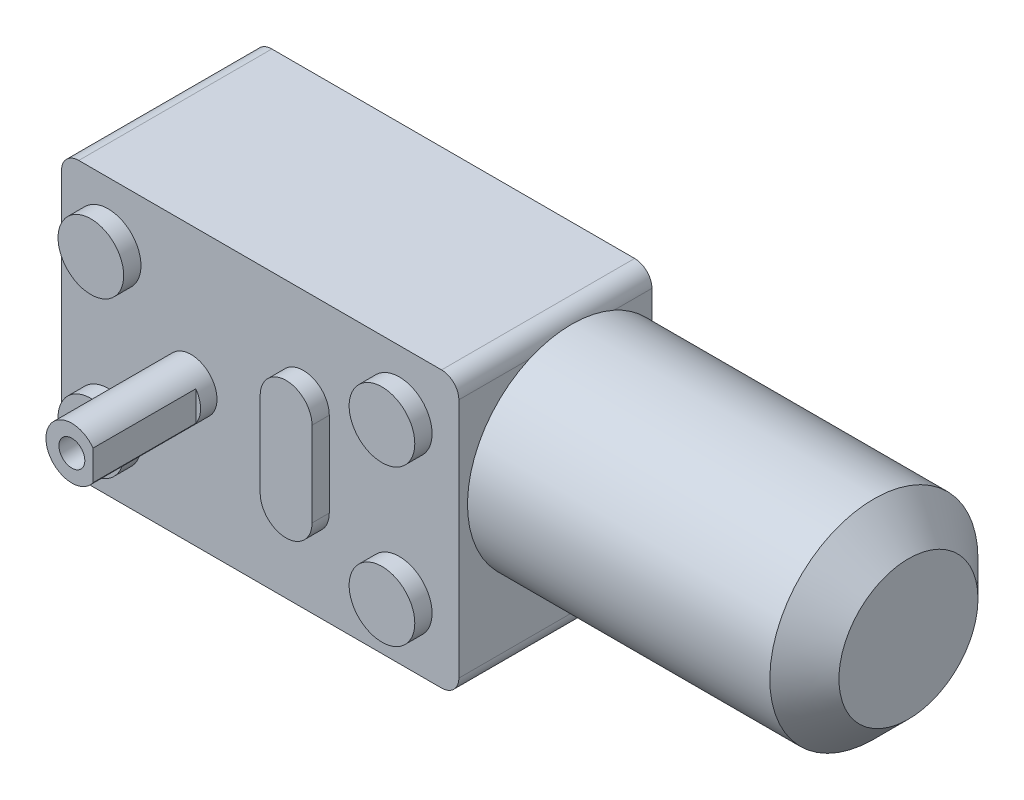
ISO-10303-21;
HEADER;
FILE_DESCRIPTION(('STEP AP214'),'2;1');
FILE_NAME('part.step','',(''),(''),'','','');
FILE_SCHEMA(('AUTOMOTIVE_DESIGN { 1 0 10303 214 1 1 1 1 }'));
ENDSEC;
DATA;
#1=APPLICATION_CONTEXT('core data for automotive mechanical design processes');
#2=APPLICATION_PROTOCOL_DEFINITION('international standard','automotive_design',2000,#1);
#3=PRODUCT_CONTEXT('',#1,'mechanical');
#4=PRODUCT('Part','Part','',(#3));
#5=PRODUCT_RELATED_PRODUCT_CATEGORY('part','',(#4));
#6=PRODUCT_DEFINITION_FORMATION('','',#4);
#7=PRODUCT_DEFINITION_CONTEXT('part definition',#1,'design');
#8=PRODUCT_DEFINITION('design','',#6,#7);
#9=PRODUCT_DEFINITION_SHAPE('','',#8);
#10=(LENGTH_UNIT() NAMED_UNIT(*) SI_UNIT(.MILLI.,.METRE.));
#11=(NAMED_UNIT(*) PLANE_ANGLE_UNIT() SI_UNIT($,.RADIAN.));
#12=(NAMED_UNIT(*) SI_UNIT($,.STERADIAN.) SOLID_ANGLE_UNIT());
#13=UNCERTAINTY_MEASURE_WITH_UNIT(LENGTH_MEASURE(1.E-05),#10,'distance_accuracy_value','');
#14=(GEOMETRIC_REPRESENTATION_CONTEXT(3) GLOBAL_UNCERTAINTY_ASSIGNED_CONTEXT((#13)) GLOBAL_UNIT_ASSIGNED_CONTEXT((#10,
#11,#12)) REPRESENTATION_CONTEXT('',''));
#15=CARTESIAN_POINT('',(0.,0.,0.));
#16=DIRECTION('',(0.,0.,1.));
#17=DIRECTION('',(1.,0.,0.));
#18=AXIS2_PLACEMENT_3D('',#15,#16,#17);
#19=CARTESIAN_POINT('',(31.,0.,-22.35));
#20=DIRECTION('',(1.,0.,0.));
#21=DIRECTION('',(0.,0.,-1.));
#22=AXIS2_PLACEMENT_3D('',#19,#20,#21);
#23=PLANE('',#22);
#24=DIRECTION('',(0.,1.,0.));
#25=VECTOR('',#24,1.);
#26=CARTESIAN_POINT('',(31.,0.,-22.35));
#27=LINE('',#26,#25);
#28=CARTESIAN_POINT('',(31.,-13.95,-22.35));
#29=VERTEX_POINT('',#28);
#30=CARTESIAN_POINT('',(31.,-4.71240823762345,-22.35));
#31=VERTEX_POINT('',#30);
#32=EDGE_CURVE('E151',#29,#31,#27,.T.);
#33=ORIENTED_EDGE('',*,*,#32,.T.);
#34=CARTESIAN_POINT('',(31.,2.95000000000001,-13.05));
#35=DIRECTION('',(1.,0.,0.));
#36=DIRECTION('',(0.,0.,-1.));
#37=AXIS2_PLACEMENT_3D('',#34,#35,#36);
#38=CIRCLE('',#37,12.05);
#39=CARTESIAN_POINT('',(31.,13.95,-8.13039635742878));
#40=VERTEX_POINT('',#39);
#41=EDGE_CURVE('E75',#40,#31,#38,.T.);
#42=ORIENTED_EDGE('',*,*,#41,.F.);
#43=DIRECTION('',(0.,0.,1.));
#44=VECTOR('',#43,1.);
#45=CARTESIAN_POINT('',(31.,13.95,-22.35));
#46=LINE('',#45,#44);
#47=CARTESIAN_POINT('',(31.,13.95,0.));
#48=VERTEX_POINT('',#47);
#49=EDGE_CURVE('E242',#40,#48,#46,.T.);
#50=ORIENTED_EDGE('',*,*,#49,.T.);
#51=DIRECTION('',(0.,1.,0.));
#52=VECTOR('',#51,1.);
#53=CARTESIAN_POINT('',(31.,0.,0.));
#54=LINE('',#53,#52);
#55=CARTESIAN_POINT('',(31.,-13.95,0.));
#56=VERTEX_POINT('',#55);
#57=EDGE_CURVE('E215',#56,#48,#54,.T.);
#58=ORIENTED_EDGE('',*,*,#57,.F.);
#59=DIRECTION('',(0.,0.,1.));
#60=VECTOR('',#59,1.);
#61=CARTESIAN_POINT('',(31.,-13.95,-22.35));
#62=LINE('',#61,#60);
#63=EDGE_CURVE('E243',#29,#56,#62,.T.);
#64=ORIENTED_EDGE('',*,*,#63,.F.);
#65=EDGE_LOOP('',(#33,#42,#50,#58,#64));
#66=FACE_BOUND('',#65,.T.);
#67=ADVANCED_FACE('F58',(#66),#23,.T.);
#68=CARTESIAN_POINT('',(-15.,0.,-22.35));
#69=DIRECTION('',(1.,0.,0.));
#70=DIRECTION('',(0.,1.,0.));
#71=AXIS2_PLACEMENT_3D('',#68,#69,#70);
#72=PLANE('',#71);
#73=DIRECTION('',(0.,1.,0.));
#74=VECTOR('',#73,1.);
#75=CARTESIAN_POINT('',(-15.,0.,0.));
#76=LINE('',#75,#74);
#77=CARTESIAN_POINT('',(-15.,-13.95,0.));
#78=VERTEX_POINT('',#77);
#79=CARTESIAN_POINT('',(-15.,13.95,0.));
#80=VERTEX_POINT('',#79);
#81=EDGE_CURVE('E174',#78,#80,#76,.T.);
#82=ORIENTED_EDGE('',*,*,#81,.T.);
#83=DIRECTION('',(0.,0.,1.));
#84=VECTOR('',#83,1.);
#85=CARTESIAN_POINT('',(-15.,13.95,-22.35));
#86=LINE('',#85,#84);
#87=CARTESIAN_POINT('',(-15.,13.95,-22.35));
#88=VERTEX_POINT('',#87);
#89=EDGE_CURVE('E229',#88,#80,#86,.T.);
#90=ORIENTED_EDGE('',*,*,#89,.F.);
#91=DIRECTION('',(0.,1.,0.));
#92=VECTOR('',#91,1.);
#93=CARTESIAN_POINT('',(-15.,0.,-22.35));
#94=LINE('',#93,#92);
#95=CARTESIAN_POINT('',(-15.,-13.95,-22.35));
#96=VERTEX_POINT('',#95);
#97=EDGE_CURVE('E175',#96,#88,#94,.T.);
#98=ORIENTED_EDGE('',*,*,#97,.F.);
#99=DIRECTION('',(0.,0.,1.));
#100=VECTOR('',#99,1.);
#101=CARTESIAN_POINT('',(-15.,-13.95,-22.35));
#102=LINE('',#101,#100);
#103=EDGE_CURVE('E199',#96,#78,#102,.T.);
#104=ORIENTED_EDGE('',*,*,#103,.T.);
#105=EDGE_LOOP('',(#82,#90,#98,#104));
#106=FACE_BOUND('',#105,.T.);
#107=ADVANCED_FACE('F270',(#106),#72,.F.);
#108=CARTESIAN_POINT('',(-13.,13.95,-22.35));
#109=DIRECTION('',(0.,0.,1.));
#110=DIRECTION('',(1.,0.,0.));
#111=AXIS2_PLACEMENT_3D('',#108,#109,#110);
#112=CYLINDRICAL_SURFACE('',#111,2.);
#113=CARTESIAN_POINT('',(-13.,13.95,0.));
#114=DIRECTION('',(0.,0.,1.));
#115=DIRECTION('',(1.,0.,0.));
#116=AXIS2_PLACEMENT_3D('',#113,#114,#115);
#117=CIRCLE('',#116,2.);
#118=CARTESIAN_POINT('',(-13.,15.95,0.));
#119=VERTEX_POINT('',#118);
#120=EDGE_CURVE('E179',#80,#119,#117,.F.);
#121=ORIENTED_EDGE('',*,*,#120,.T.);
#122=DIRECTION('',(0.,0.,1.));
#123=VECTOR('',#122,1.);
#124=CARTESIAN_POINT('',(-13.,15.95,-22.35));
#125=LINE('',#124,#123);
#126=CARTESIAN_POINT('',(-13.,15.95,-22.35));
#127=VERTEX_POINT('',#126);
#128=EDGE_CURVE('E233',#127,#119,#125,.T.);
#129=ORIENTED_EDGE('',*,*,#128,.F.);
#130=CARTESIAN_POINT('',(-13.,13.95,-22.35));
#131=DIRECTION('',(0.,0.,1.));
#132=DIRECTION('',(1.,0.,0.));
#133=AXIS2_PLACEMENT_3D('',#130,#131,#132);
#134=CIRCLE('',#133,2.);
#135=EDGE_CURVE('E196',#88,#127,#134,.F.);
#136=ORIENTED_EDGE('',*,*,#135,.F.);
#137=ORIENTED_EDGE('',*,*,#89,.T.);
#138=EDGE_LOOP('',(#121,#129,#136,#137));
#139=FACE_BOUND('',#138,.T.);
#140=ADVANCED_FACE('F277',(#139),#112,.T.);
#141=CARTESIAN_POINT('',(0.,15.95,-22.35));
#142=DIRECTION('',(0.,-1.,0.));
#143=DIRECTION('',(1.,0.,0.));
#144=AXIS2_PLACEMENT_3D('',#141,#142,#143);
#145=PLANE('',#144);
#146=DIRECTION('',(1.,0.,0.));
#147=VECTOR('',#146,1.);
#148=CARTESIAN_POINT('',(0.,15.95,0.));
#149=LINE('',#148,#147);
#150=CARTESIAN_POINT('',(29.,15.95,0.));
#151=VERTEX_POINT('',#150);
#152=EDGE_CURVE('E223',#119,#151,#149,.T.);
#153=ORIENTED_EDGE('',*,*,#152,.T.);
#154=DIRECTION('',(0.,0.,1.));
#155=VECTOR('',#154,1.);
#156=CARTESIAN_POINT('',(29.,15.95,-22.35));
#157=LINE('',#156,#155);
#158=CARTESIAN_POINT('',(29.,15.95,-22.35));
#159=VERTEX_POINT('',#158);
#160=EDGE_CURVE('E237',#159,#151,#157,.T.);
#161=ORIENTED_EDGE('',*,*,#160,.F.);
#162=DIRECTION('',(1.,0.,0.));
#163=VECTOR('',#162,1.);
#164=CARTESIAN_POINT('',(0.,15.95,-22.35));
#165=LINE('',#164,#163);
#166=EDGE_CURVE('E193',#127,#159,#165,.T.);
#167=ORIENTED_EDGE('',*,*,#166,.F.);
#168=ORIENTED_EDGE('',*,*,#128,.T.);
#169=EDGE_LOOP('',(#153,#161,#167,#168));
#170=FACE_BOUND('',#169,.T.);
#171=ADVANCED_FACE('F290',(#170),#145,.F.);
#172=CARTESIAN_POINT('',(29.,13.95,-22.35));
#173=DIRECTION('',(0.,0.,1.));
#174=DIRECTION('',(1.,0.,0.));
#175=AXIS2_PLACEMENT_3D('',#172,#173,#174);
#176=CYLINDRICAL_SURFACE('',#175,2.);
#177=CARTESIAN_POINT('',(29.,13.95,0.));
#178=DIRECTION('',(0.,0.,1.));
#179=DIRECTION('',(1.,0.,0.));
#180=AXIS2_PLACEMENT_3D('',#177,#178,#179);
#181=CIRCLE('',#180,2.);
#182=EDGE_CURVE('E219',#48,#151,#181,.T.);
#183=ORIENTED_EDGE('',*,*,#182,.F.);
#184=ORIENTED_EDGE('',*,*,#49,.F.);
#185=DIRECTION('',(0.,0.,1.));
#186=VECTOR('',#185,1.);
#187=CARTESIAN_POINT('',(31.,13.95,-22.35));
#188=LINE('',#187,#186);
#189=CARTESIAN_POINT('',(31.,13.95,-17.9696036425712));
#190=VERTEX_POINT('',#189);
#191=EDGE_CURVE('E82',#40,#190,#188,.F.);
#192=ORIENTED_EDGE('',*,*,#191,.T.);
#193=CARTESIAN_POINT('',(31.,13.95,-22.35));
#194=VERTEX_POINT('',#193);
#195=EDGE_CURVE('E155',#194,#190,#46,.T.);
#196=ORIENTED_EDGE('',*,*,#195,.F.);
#197=CARTESIAN_POINT('',(29.,13.95,-22.35));
#198=DIRECTION('',(0.,0.,1.));
#199=DIRECTION('',(1.,0.,0.));
#200=AXIS2_PLACEMENT_3D('',#197,#198,#199);
#201=CIRCLE('',#200,2.);
#202=EDGE_CURVE('E146',#194,#159,#201,.T.);
#203=ORIENTED_EDGE('',*,*,#202,.T.);
#204=ORIENTED_EDGE('',*,*,#160,.T.);
#205=EDGE_LOOP('',(#183,#184,#192,#196,#203,#204));
#206=FACE_BOUND('',#205,.T.);
#207=ADVANCED_FACE('F283',(#206),#176,.T.);
#208=ORIENTED_EDGE('',*,*,#195,.T.);
#209=CARTESIAN_POINT('',(31.,10.6124082376235,-22.35));
#210=VERTEX_POINT('',#209);
#211=EDGE_CURVE('E153',#210,#190,#38,.T.);
#212=ORIENTED_EDGE('',*,*,#211,.F.);
#213=EDGE_CURVE('E138',#210,#194,#27,.T.);
#214=ORIENTED_EDGE('',*,*,#213,.T.);
#215=EDGE_LOOP('',(#208,#212,#214));
#216=FACE_BOUND('',#215,.T.);
#217=ADVANCED_FACE('F154',(#216),#23,.T.);
#218=CARTESIAN_POINT('',(29.,-13.95,-22.35));
#219=DIRECTION('',(0.,0.,1.));
#220=DIRECTION('',(1.,0.,0.));
#221=AXIS2_PLACEMENT_3D('',#218,#219,#220);
#222=CYLINDRICAL_SURFACE('',#221,2.);
#223=CARTESIAN_POINT('',(29.,-13.95,0.));
#224=DIRECTION('',(0.,0.,1.));
#225=DIRECTION('',(1.,0.,0.));
#226=AXIS2_PLACEMENT_3D('',#223,#224,#225);
#227=CIRCLE('',#226,2.);
#228=CARTESIAN_POINT('',(29.,-15.95,0.));
#229=VERTEX_POINT('',#228);
#230=EDGE_CURVE('E211',#229,#56,#227,.T.);
#231=ORIENTED_EDGE('',*,*,#230,.F.);
#232=DIRECTION('',(0.,0.,1.));
#233=VECTOR('',#232,1.);
#234=CARTESIAN_POINT('',(29.,-15.95,-22.35));
#235=LINE('',#234,#233);
#236=CARTESIAN_POINT('',(29.,-15.95,-22.35));
#237=VERTEX_POINT('',#236);
#238=EDGE_CURVE('E246',#237,#229,#235,.T.);
#239=ORIENTED_EDGE('',*,*,#238,.F.);
#240=CARTESIAN_POINT('',(29.,-13.95,-22.35));
#241=DIRECTION('',(0.,0.,1.));
#242=DIRECTION('',(1.,0.,0.));
#243=AXIS2_PLACEMENT_3D('',#240,#241,#242);
#244=CIRCLE('',#243,2.);
#245=EDGE_CURVE('E149',#237,#29,#244,.T.);
#246=ORIENTED_EDGE('',*,*,#245,.T.);
#247=ORIENTED_EDGE('',*,*,#63,.T.);
#248=EDGE_LOOP('',(#231,#239,#246,#247));
#249=FACE_BOUND('',#248,.T.);
#250=ADVANCED_FACE('F282',(#249),#222,.T.);
#251=CARTESIAN_POINT('',(0.,-15.95,-22.35));
#252=DIRECTION('',(0.,-1.,0.));
#253=DIRECTION('',(1.,0.,0.));
#254=AXIS2_PLACEMENT_3D('',#251,#252,#253);
#255=PLANE('',#254);
#256=DIRECTION('',(1.,0.,0.));
#257=VECTOR('',#256,1.);
#258=CARTESIAN_POINT('',(0.,-15.95,0.));
#259=LINE('',#258,#257);
#260=CARTESIAN_POINT('',(-13.,-15.95,0.));
#261=VERTEX_POINT('',#260);
#262=EDGE_CURVE('E207',#261,#229,#259,.T.);
#263=ORIENTED_EDGE('',*,*,#262,.F.);
#264=DIRECTION('',(0.,0.,1.));
#265=VECTOR('',#264,1.);
#266=CARTESIAN_POINT('',(-13.,-15.95,-22.35));
#267=LINE('',#266,#265);
#268=CARTESIAN_POINT('',(-13.,-15.95,-22.35));
#269=VERTEX_POINT('',#268);
#270=EDGE_CURVE('E249',#269,#261,#267,.T.);
#271=ORIENTED_EDGE('',*,*,#270,.F.);
#272=DIRECTION('',(1.,0.,0.));
#273=VECTOR('',#272,1.);
#274=CARTESIAN_POINT('',(0.,-15.95,-22.35));
#275=LINE('',#274,#273);
#276=EDGE_CURVE('E183',#269,#237,#275,.T.);
#277=ORIENTED_EDGE('',*,*,#276,.T.);
#278=ORIENTED_EDGE('',*,*,#238,.T.);
#279=EDGE_LOOP('',(#263,#271,#277,#278));
#280=FACE_BOUND('',#279,.T.);
#281=ADVANCED_FACE('F288',(#280),#255,.T.);
#282=CARTESIAN_POINT('',(-13.,-13.95,-22.35));
#283=DIRECTION('',(0.,0.,1.));
#284=DIRECTION('',(1.,0.,0.));
#285=AXIS2_PLACEMENT_3D('',#282,#283,#284);
#286=CYLINDRICAL_SURFACE('',#285,2.);
#287=CARTESIAN_POINT('',(-13.,-13.95,0.));
#288=DIRECTION('',(0.,0.,1.));
#289=DIRECTION('',(1.,0.,0.));
#290=AXIS2_PLACEMENT_3D('',#287,#288,#289);
#291=CIRCLE('',#290,2.);
#292=EDGE_CURVE('E203',#78,#261,#291,.T.);
#293=ORIENTED_EDGE('',*,*,#292,.F.);
#294=ORIENTED_EDGE('',*,*,#103,.F.);
#295=CARTESIAN_POINT('',(-13.,-13.95,-22.35));
#296=DIRECTION('',(0.,0.,1.));
#297=DIRECTION('',(1.,0.,0.));
#298=AXIS2_PLACEMENT_3D('',#295,#296,#297);
#299=CIRCLE('',#298,2.);
#300=EDGE_CURVE('E178',#96,#269,#299,.T.);
#301=ORIENTED_EDGE('',*,*,#300,.T.);
#302=ORIENTED_EDGE('',*,*,#270,.T.);
#303=EDGE_LOOP('',(#293,#294,#301,#302));
#304=FACE_BOUND('',#303,.T.);
#305=ADVANCED_FACE('F305',(#304),#286,.T.);
#306=CARTESIAN_POINT('',(0.,0.,-22.35));
#307=DIRECTION('',(0.,0.,1.));
#308=DIRECTION('',(1.,0.,0.));
#309=AXIS2_PLACEMENT_3D('',#306,#307,#308);
#310=PLANE('',#309);
#311=ORIENTED_EDGE('',*,*,#97,.T.);
#312=ORIENTED_EDGE('',*,*,#135,.T.);
#313=ORIENTED_EDGE('',*,*,#166,.T.);
#314=ORIENTED_EDGE('',*,*,#202,.F.);
#315=ORIENTED_EDGE('',*,*,#213,.F.);
#316=EDGE_CURVE('E144',#31,#210,#27,.T.);
#317=ORIENTED_EDGE('',*,*,#316,.F.);
#318=ORIENTED_EDGE('',*,*,#32,.F.);
#319=ORIENTED_EDGE('',*,*,#245,.F.);
#320=ORIENTED_EDGE('',*,*,#276,.F.);
#321=ORIENTED_EDGE('',*,*,#300,.F.);
#322=EDGE_LOOP('',(#311,#312,#313,#314,#315,#317,#318,#319,#320,#321));
#323=FACE_BOUND('',#322,.T.);
#324=ADVANCED_FACE('F141',(#323),#310,.F.);
#325=CARTESIAN_POINT('',(0.,0.,0.));
#326=DIRECTION('',(0.,0.,1.));
#327=DIRECTION('',(1.,0.,0.));
#328=AXIS2_PLACEMENT_3D('',#325,#326,#327);
#329=PLANE('',#328);
#330=ORIENTED_EDGE('',*,*,#81,.F.);
#331=ORIENTED_EDGE('',*,*,#292,.T.);
#332=ORIENTED_EDGE('',*,*,#262,.T.);
#333=ORIENTED_EDGE('',*,*,#230,.T.);
#334=ORIENTED_EDGE('',*,*,#57,.T.);
#335=ORIENTED_EDGE('',*,*,#182,.T.);
#336=ORIENTED_EDGE('',*,*,#152,.F.);
#337=ORIENTED_EDGE('',*,*,#120,.F.);
#338=EDGE_LOOP('',(#330,#331,#332,#333,#334,#335,#336,#337));
#339=FACE_BOUND('',#338,.T.);
#340=ADVANCED_FACE('F301',(#339),#329,.T.);
#341=CARTESIAN_POINT('',(31.,2.95000000000001,-13.05));
#342=DIRECTION('',(1.,0.,0.));
#343=DIRECTION('',(0.,0.,-1.));
#344=AXIS2_PLACEMENT_3D('',#341,#342,#343);
#345=PLANE('',#344);
#346=EDGE_CURVE('E163',#31,#210,#38,.T.);
#347=ORIENTED_EDGE('',*,*,#346,.F.);
#348=ORIENTED_EDGE('',*,*,#316,.T.);
#349=EDGE_LOOP('',(#347,#348));
#350=FACE_BOUND('',#349,.T.);
#351=ADVANCED_FACE('F166',(#350),#345,.F.);
#352=CARTESIAN_POINT('',(70.,2.95000000000001,-13.05));
#353=DIRECTION('',(-1.,0.,0.));
#354=DIRECTION('',(0.,0.,1.));
#355=AXIS2_PLACEMENT_3D('',#352,#353,#354);
#356=CYLINDRICAL_SURFACE('',#355,12.05);
#357=CARTESIAN_POINT('',(66.,2.95000000000001,-13.05));
#358=DIRECTION('',(1.,0.,0.));
#359=DIRECTION('',(0.,0.,-1.));
#360=AXIS2_PLACEMENT_3D('',#357,#358,#359);
#361=CIRCLE('',#360,12.05);
#362=CARTESIAN_POINT('',(66.,2.95000000000001,-25.1));
#363=VERTEX_POINT('',#362);
#364=EDGE_CURVE('E12',#363,#363,#361,.F.);
#365=ORIENTED_EDGE('',*,*,#364,.T.);
#366=EDGE_LOOP('',(#365));
#367=FACE_BOUND('',#366,.T.);
#368=ORIENTED_EDGE('',*,*,#211,.T.);
#369=EDGE_CURVE('E161',#190,#40,#38,.T.);
#370=ORIENTED_EDGE('',*,*,#369,.T.);
#371=ORIENTED_EDGE('',*,*,#41,.T.);
#372=ORIENTED_EDGE('',*,*,#346,.T.);
#373=EDGE_LOOP('',(#368,#370,#371,#372));
#374=FACE_BOUND('',#373,.T.);
#375=ADVANCED_FACE('F168',(#367,#374),#356,.T.);
#376=CARTESIAN_POINT('',(70.,2.95000000000001,-13.05));
#377=DIRECTION('',(1.,0.,0.));
#378=DIRECTION('',(0.,0.,-1.));
#379=AXIS2_PLACEMENT_3D('',#376,#377,#378);
#380=PLANE('',#379);
#381=CARTESIAN_POINT('',(70.,2.95000000000001,-13.05));
#382=DIRECTION('',(1.,0.,0.));
#383=DIRECTION('',(0.,0.,-1.));
#384=AXIS2_PLACEMENT_3D('',#381,#382,#383);
#385=CIRCLE('',#384,8.05);
#386=CARTESIAN_POINT('',(70.,2.95000000000001,-21.1));
#387=VERTEX_POINT('',#386);
#388=EDGE_CURVE('E68',#387,#387,#385,.T.);
#389=ORIENTED_EDGE('',*,*,#388,.T.);
#390=EDGE_LOOP('',(#389));
#391=FACE_BOUND('',#390,.T.);
#392=ADVANCED_FACE('F257',(#391),#380,.T.);
#393=ORIENTED_EDGE('',*,*,#191,.F.);
#394=ORIENTED_EDGE('',*,*,#369,.F.);
#395=EDGE_LOOP('',(#393,#394));
#396=FACE_BOUND('',#395,.T.);
#397=ADVANCED_FACE('F260',(#396),#345,.F.);
#398=CARTESIAN_POINT('',(70.,2.95000000000001,-13.05));
#399=DIRECTION('',(-1.,0.,0.));
#400=DIRECTION('',(0.,0.,1.));
#401=AXIS2_PLACEMENT_3D('',#398,#399,#400);
#402=CONICAL_SURFACE('',#401,8.05,0.785398163397447);
#403=ORIENTED_EDGE('',*,*,#364,.F.);
#404=EDGE_LOOP('',(#403));
#405=FACE_BOUND('',#404,.T.);
#406=ORIENTED_EDGE('',*,*,#388,.F.);
#407=EDGE_LOOP('',(#406));
#408=FACE_BOUND('',#407,.T.);
#409=ADVANCED_FACE('F61',(#405,#408),#402,.T.);
#410=CLOSED_SHELL('',(#67,#107,#140,#171,#207,#217,#250,#281,#305,#324,#340,#351,#375,#392,#397,#409));
#411=MANIFOLD_SOLID_BREP('B2',#410);
#412=CARTESIAN_POINT('',(-9.6,-9.,2.));
#413=DIRECTION('',(0.,0.,-1.));
#414=DIRECTION('',(-1.,0.,0.));
#415=AXIS2_PLACEMENT_3D('',#412,#413,#414);
#416=CYLINDRICAL_SURFACE('',#415,3.8);
#417=CARTESIAN_POINT('',(-9.6,-9.,2.));
#418=DIRECTION('',(0.,0.,1.));
#419=DIRECTION('',(1.,0.,0.));
#420=AXIS2_PLACEMENT_3D('',#417,#418,#419);
#421=CIRCLE('',#420,3.8);
#422=CARTESIAN_POINT('',(-5.8,-9.,2.));
#423=VERTEX_POINT('',#422);
#424=EDGE_CURVE('E57',#423,#423,#421,.T.);
#425=ORIENTED_EDGE('',*,*,#424,.F.);
#426=EDGE_LOOP('',(#425));
#427=FACE_BOUND('',#426,.T.);
#428=CARTESIAN_POINT('',(-9.6,-9.,0.));
#429=DIRECTION('',(0.,0.,1.));
#430=DIRECTION('',(1.,0.,0.));
#431=AXIS2_PLACEMENT_3D('',#428,#429,#430);
#432=CIRCLE('',#431,3.8);
#433=CARTESIAN_POINT('',(-5.8,-9.,0.));
#434=VERTEX_POINT('',#433);
#435=EDGE_CURVE('E436',#434,#434,#432,.T.);
#436=ORIENTED_EDGE('',*,*,#435,.T.);
#437=EDGE_LOOP('',(#436));
#438=FACE_BOUND('',#437,.T.);
#439=ADVANCED_FACE('F433',(#427,#438),#416,.T.);
#440=CARTESIAN_POINT('',(0.,0.,2.));
#441=DIRECTION('',(0.,0.,1.));
#442=DIRECTION('',(1.,0.,0.));
#443=AXIS2_PLACEMENT_3D('',#440,#441,#442);
#444=PLANE('',#443);
#445=ORIENTED_EDGE('',*,*,#424,.T.);
#446=EDGE_LOOP('',(#445));
#447=FACE_BOUND('',#446,.T.);
#448=ADVANCED_FACE('F448',(#447),#444,.T.);
#449=CARTESIAN_POINT('',(0.,0.,0.));
#450=DIRECTION('',(0.,0.,1.));
#451=DIRECTION('',(1.,0.,0.));
#452=AXIS2_PLACEMENT_3D('',#449,#450,#451);
#453=PLANE('',#452);
#454=ORIENTED_EDGE('',*,*,#435,.F.);
#455=EDGE_LOOP('',(#454));
#456=FACE_BOUND('',#455,.T.);
#457=ADVANCED_FACE('F446',(#456),#453,.F.);
#458=CLOSED_SHELL('',(#439,#448,#457));
#459=MANIFOLD_SOLID_BREP('B6',#458);
#460=CARTESIAN_POINT('',(-9.6,9.,2.));
#461=DIRECTION('',(0.,0.,-1.));
#462=DIRECTION('',(-1.,0.,0.));
#463=AXIS2_PLACEMENT_3D('',#460,#461,#462);
#464=CYLINDRICAL_SURFACE('',#463,3.8);
#465=CARTESIAN_POINT('',(-9.6,9.,2.));
#466=DIRECTION('',(0.,0.,1.));
#467=DIRECTION('',(1.,0.,0.));
#468=AXIS2_PLACEMENT_3D('',#465,#466,#467);
#469=CIRCLE('',#468,3.8);
#470=CARTESIAN_POINT('',(-5.8,9.,2.));
#471=VERTEX_POINT('',#470);
#472=EDGE_CURVE('E432',#471,#471,#469,.T.);
#473=ORIENTED_EDGE('',*,*,#472,.F.);
#474=EDGE_LOOP('',(#473));
#475=FACE_BOUND('',#474,.T.);
#476=CARTESIAN_POINT('',(-9.6,9.,0.));
#477=DIRECTION('',(0.,0.,1.));
#478=DIRECTION('',(1.,0.,0.));
#479=AXIS2_PLACEMENT_3D('',#476,#477,#478);
#480=CIRCLE('',#479,3.8);
#481=CARTESIAN_POINT('',(-5.8,9.,0.));
#482=VERTEX_POINT('',#481);
#483=EDGE_CURVE('E485',#482,#482,#480,.T.);
#484=ORIENTED_EDGE('',*,*,#483,.T.);
#485=EDGE_LOOP('',(#484));
#486=FACE_BOUND('',#485,.T.);
#487=ADVANCED_FACE('F482',(#475,#486),#464,.T.);
#488=CARTESIAN_POINT('',(0.,0.,2.));
#489=DIRECTION('',(0.,0.,1.));
#490=DIRECTION('',(1.,0.,0.));
#491=AXIS2_PLACEMENT_3D('',#488,#489,#490);
#492=PLANE('',#491);
#493=ORIENTED_EDGE('',*,*,#472,.T.);
#494=EDGE_LOOP('',(#493));
#495=FACE_BOUND('',#494,.T.);
#496=ADVANCED_FACE('F497',(#495),#492,.T.);
#497=CARTESIAN_POINT('',(0.,0.,0.));
#498=DIRECTION('',(0.,0.,1.));
#499=DIRECTION('',(1.,0.,0.));
#500=AXIS2_PLACEMENT_3D('',#497,#498,#499);
#501=PLANE('',#500);
#502=ORIENTED_EDGE('',*,*,#483,.F.);
#503=EDGE_LOOP('',(#502));
#504=FACE_BOUND('',#503,.T.);
#505=ADVANCED_FACE('F495',(#504),#501,.F.);
#506=CLOSED_SHELL('',(#487,#496,#505));
#507=MANIFOLD_SOLID_BREP('B52',#506);
#508=CARTESIAN_POINT('',(24.1,-9.,2.));
#509=DIRECTION('',(0.,0.,-1.));
#510=DIRECTION('',(-1.,0.,0.));
#511=AXIS2_PLACEMENT_3D('',#508,#509,#510);
#512=CYLINDRICAL_SURFACE('',#511,3.8);
#513=CARTESIAN_POINT('',(24.1,-9.,2.));
#514=DIRECTION('',(0.,0.,1.));
#515=DIRECTION('',(1.,0.,0.));
#516=AXIS2_PLACEMENT_3D('',#513,#514,#515);
#517=CIRCLE('',#516,3.8);
#518=CARTESIAN_POINT('',(27.9,-9.,2.));
#519=VERTEX_POINT('',#518);
#520=EDGE_CURVE('E481',#519,#519,#517,.T.);
#521=ORIENTED_EDGE('',*,*,#520,.F.);
#522=EDGE_LOOP('',(#521));
#523=FACE_BOUND('',#522,.T.);
#524=CARTESIAN_POINT('',(24.1,-9.,0.));
#525=DIRECTION('',(0.,0.,1.));
#526=DIRECTION('',(1.,0.,0.));
#527=AXIS2_PLACEMENT_3D('',#524,#525,#526);
#528=CIRCLE('',#527,3.8);
#529=CARTESIAN_POINT('',(27.9,-9.,0.));
#530=VERTEX_POINT('',#529);
#531=EDGE_CURVE('E534',#530,#530,#528,.T.);
#532=ORIENTED_EDGE('',*,*,#531,.T.);
#533=EDGE_LOOP('',(#532));
#534=FACE_BOUND('',#533,.T.);
#535=ADVANCED_FACE('F531',(#523,#534),#512,.T.);
#536=CARTESIAN_POINT('',(0.,0.,2.));
#537=DIRECTION('',(0.,0.,1.));
#538=DIRECTION('',(1.,0.,0.));
#539=AXIS2_PLACEMENT_3D('',#536,#537,#538);
#540=PLANE('',#539);
#541=ORIENTED_EDGE('',*,*,#520,.T.);
#542=EDGE_LOOP('',(#541));
#543=FACE_BOUND('',#542,.T.);
#544=ADVANCED_FACE('F546',(#543),#540,.T.);
#545=CARTESIAN_POINT('',(0.,0.,0.));
#546=DIRECTION('',(0.,0.,1.));
#547=DIRECTION('',(1.,0.,0.));
#548=AXIS2_PLACEMENT_3D('',#545,#546,#547);
#549=PLANE('',#548);
#550=ORIENTED_EDGE('',*,*,#531,.F.);
#551=EDGE_LOOP('',(#550));
#552=FACE_BOUND('',#551,.T.);
#553=ADVANCED_FACE('F544',(#552),#549,.F.);
#554=CLOSED_SHELL('',(#535,#544,#553));
#555=MANIFOLD_SOLID_BREP('B427',#554);
#556=CARTESIAN_POINT('',(24.1,9.,2.));
#557=DIRECTION('',(0.,0.,-1.));
#558=DIRECTION('',(-1.,0.,0.));
#559=AXIS2_PLACEMENT_3D('',#556,#557,#558);
#560=CYLINDRICAL_SURFACE('',#559,3.8);
#561=CARTESIAN_POINT('',(24.1,9.,2.));
#562=DIRECTION('',(0.,0.,1.));
#563=DIRECTION('',(1.,0.,0.));
#564=AXIS2_PLACEMENT_3D('',#561,#562,#563);
#565=CIRCLE('',#564,3.8);
#566=CARTESIAN_POINT('',(27.9,9.,2.));
#567=VERTEX_POINT('',#566);
#568=EDGE_CURVE('E530',#567,#567,#565,.T.);
#569=ORIENTED_EDGE('',*,*,#568,.F.);
#570=EDGE_LOOP('',(#569));
#571=FACE_BOUND('',#570,.T.);
#572=CARTESIAN_POINT('',(24.1,9.,0.));
#573=DIRECTION('',(0.,0.,1.));
#574=DIRECTION('',(1.,0.,0.));
#575=AXIS2_PLACEMENT_3D('',#572,#573,#574);
#576=CIRCLE('',#575,3.8);
#577=CARTESIAN_POINT('',(27.9,9.,0.));
#578=VERTEX_POINT('',#577);
#579=EDGE_CURVE('E585',#578,#578,#576,.T.);
#580=ORIENTED_EDGE('',*,*,#579,.T.);
#581=EDGE_LOOP('',(#580));
#582=FACE_BOUND('',#581,.T.);
#583=ADVANCED_FACE('F582',(#571,#582),#560,.T.);
#584=CARTESIAN_POINT('',(0.,0.,2.));
#585=DIRECTION('',(0.,0.,1.));
#586=DIRECTION('',(1.,0.,0.));
#587=AXIS2_PLACEMENT_3D('',#584,#585,#586);
#588=PLANE('',#587);
#589=ORIENTED_EDGE('',*,*,#568,.T.);
#590=EDGE_LOOP('',(#589));
#591=FACE_BOUND('',#590,.T.);
#592=ADVANCED_FACE('F597',(#591),#588,.T.);
#593=CARTESIAN_POINT('',(0.,0.,0.));
#594=DIRECTION('',(0.,0.,1.));
#595=DIRECTION('',(1.,0.,0.));
#596=AXIS2_PLACEMENT_3D('',#593,#594,#595);
#597=PLANE('',#596);
#598=ORIENTED_EDGE('',*,*,#579,.F.);
#599=EDGE_LOOP('',(#598));
#600=FACE_BOUND('',#599,.T.);
#601=ADVANCED_FACE('F595',(#600),#597,.F.);
#602=CLOSED_SHELL('',(#583,#592,#601));
#603=MANIFOLD_SOLID_BREP('B476',#602);
#604=CARTESIAN_POINT('',(16.,0.,2.));
#605=DIRECTION('',(-1.,0.,0.));
#606=DIRECTION('',(0.,0.,1.));
#607=AXIS2_PLACEMENT_3D('',#604,#605,#606);
#608=PLANE('',#607);
#609=DIRECTION('',(0.,1.,0.));
#610=VECTOR('',#609,1.);
#611=CARTESIAN_POINT('',(16.,0.,0.));
#612=LINE('',#611,#610);
#613=CARTESIAN_POINT('',(16.,-4.9,0.));
#614=VERTEX_POINT('',#613);
#615=CARTESIAN_POINT('',(16.,4.9,0.));
#616=VERTEX_POINT('',#615);
#617=EDGE_CURVE('E694',#614,#616,#612,.T.);
#618=ORIENTED_EDGE('',*,*,#617,.T.);
#619=DIRECTION('',(0.,0.,-1.));
#620=VECTOR('',#619,1.);
#621=CARTESIAN_POINT('',(16.,4.9,2.));
#622=LINE('',#621,#620);
#623=CARTESIAN_POINT('',(16.,4.9,2.));
#624=VERTEX_POINT('',#623);
#625=EDGE_CURVE('E580',#624,#616,#622,.T.);
#626=ORIENTED_EDGE('',*,*,#625,.F.);
#627=DIRECTION('',(0.,1.,0.));
#628=VECTOR('',#627,1.);
#629=CARTESIAN_POINT('',(16.,0.,2.));
#630=LINE('',#629,#628);
#631=CARTESIAN_POINT('',(16.,-4.9,2.));
#632=VERTEX_POINT('',#631);
#633=EDGE_CURVE('E679',#632,#624,#630,.T.);
#634=ORIENTED_EDGE('',*,*,#633,.F.);
#635=DIRECTION('',(0.,0.,-1.));
#636=VECTOR('',#635,1.);
#637=CARTESIAN_POINT('',(16.,-4.9,2.));
#638=LINE('',#637,#636);
#639=EDGE_CURVE('E690',#632,#614,#638,.T.);
#640=ORIENTED_EDGE('',*,*,#639,.T.);
#641=EDGE_LOOP('',(#618,#626,#634,#640));
#642=FACE_BOUND('',#641,.T.);
#643=ADVANCED_FACE('F632',(#642),#608,.F.);
#644=CARTESIAN_POINT('',(13.,4.9,2.));
#645=DIRECTION('',(0.,0.,-1.));
#646=DIRECTION('',(-1.,0.,0.));
#647=AXIS2_PLACEMENT_3D('',#644,#645,#646);
#648=CYLINDRICAL_SURFACE('',#647,3.);
#649=CARTESIAN_POINT('',(13.,4.9,0.));
#650=DIRECTION('',(0.,0.,1.));
#651=DIRECTION('',(1.,0.,0.));
#652=AXIS2_PLACEMENT_3D('',#649,#650,#651);
#653=CIRCLE('',#652,3.);
#654=CARTESIAN_POINT('',(10.,4.9,0.));
#655=VERTEX_POINT('',#654);
#656=EDGE_CURVE('E684',#616,#655,#653,.T.);
#657=ORIENTED_EDGE('',*,*,#656,.T.);
#658=DIRECTION('',(0.,0.,-1.));
#659=VECTOR('',#658,1.);
#660=CARTESIAN_POINT('',(10.,4.9,2.));
#661=LINE('',#660,#659);
#662=CARTESIAN_POINT('',(10.,4.9,2.));
#663=VERTEX_POINT('',#662);
#664=EDGE_CURVE('E640',#663,#655,#661,.T.);
#665=ORIENTED_EDGE('',*,*,#664,.F.);
#666=CARTESIAN_POINT('',(13.,4.9,2.));
#667=DIRECTION('',(0.,0.,1.));
#668=DIRECTION('',(1.,0.,0.));
#669=AXIS2_PLACEMENT_3D('',#666,#667,#668);
#670=CIRCLE('',#669,3.);
#671=EDGE_CURVE('E674',#624,#663,#670,.T.);
#672=ORIENTED_EDGE('',*,*,#671,.F.);
#673=ORIENTED_EDGE('',*,*,#625,.T.);
#674=EDGE_LOOP('',(#657,#665,#672,#673));
#675=FACE_BOUND('',#674,.T.);
#676=ADVANCED_FACE('F683',(#675),#648,.T.);
#677=CARTESIAN_POINT('',(10.,0.,2.));
#678=DIRECTION('',(-1.,0.,0.));
#679=DIRECTION('',(0.,0.,1.));
#680=AXIS2_PLACEMENT_3D('',#677,#678,#679);
#681=PLANE('',#680);
#682=DIRECTION('',(0.,1.,0.));
#683=VECTOR('',#682,1.);
#684=CARTESIAN_POINT('',(10.,0.,0.));
#685=LINE('',#684,#683);
#686=CARTESIAN_POINT('',(10.,-4.9,0.));
#687=VERTEX_POINT('',#686);
#688=EDGE_CURVE('E698',#687,#655,#685,.T.);
#689=ORIENTED_EDGE('',*,*,#688,.F.);
#690=DIRECTION('',(0.,0.,-1.));
#691=VECTOR('',#690,1.);
#692=CARTESIAN_POINT('',(10.,-4.9,2.));
#693=LINE('',#692,#691);
#694=CARTESIAN_POINT('',(10.,-4.9,2.));
#695=VERTEX_POINT('',#694);
#696=EDGE_CURVE('E664',#695,#687,#693,.T.);
#697=ORIENTED_EDGE('',*,*,#696,.F.);
#698=DIRECTION('',(0.,1.,0.));
#699=VECTOR('',#698,1.);
#700=CARTESIAN_POINT('',(10.,0.,2.));
#701=LINE('',#700,#699);
#702=EDGE_CURVE('E677',#695,#663,#701,.T.);
#703=ORIENTED_EDGE('',*,*,#702,.T.);
#704=ORIENTED_EDGE('',*,*,#664,.T.);
#705=EDGE_LOOP('',(#689,#697,#703,#704));
#706=FACE_BOUND('',#705,.T.);
#707=ADVANCED_FACE('F688',(#706),#681,.T.);
#708=CARTESIAN_POINT('',(13.,-4.9,2.));
#709=DIRECTION('',(0.,0.,-1.));
#710=DIRECTION('',(-1.,0.,0.));
#711=AXIS2_PLACEMENT_3D('',#708,#709,#710);
#712=CYLINDRICAL_SURFACE('',#711,3.);
#713=CARTESIAN_POINT('',(13.,-4.9,0.));
#714=DIRECTION('',(0.,0.,1.));
#715=DIRECTION('',(1.,0.,0.));
#716=AXIS2_PLACEMENT_3D('',#713,#714,#715);
#717=CIRCLE('',#716,3.);
#718=EDGE_CURVE('E667',#687,#614,#717,.T.);
#719=ORIENTED_EDGE('',*,*,#718,.T.);
#720=ORIENTED_EDGE('',*,*,#639,.F.);
#721=CARTESIAN_POINT('',(13.,-4.9,2.));
#722=DIRECTION('',(0.,0.,1.));
#723=DIRECTION('',(1.,0.,0.));
#724=AXIS2_PLACEMENT_3D('',#721,#722,#723);
#725=CIRCLE('',#724,3.);
#726=EDGE_CURVE('E648',#695,#632,#725,.T.);
#727=ORIENTED_EDGE('',*,*,#726,.F.);
#728=ORIENTED_EDGE('',*,*,#696,.T.);
#729=EDGE_LOOP('',(#719,#720,#727,#728));
#730=FACE_BOUND('',#729,.T.);
#731=ADVANCED_FACE('F711',(#730),#712,.T.);
#732=CARTESIAN_POINT('',(0.,0.,2.));
#733=DIRECTION('',(0.,0.,1.));
#734=DIRECTION('',(1.,0.,0.));
#735=AXIS2_PLACEMENT_3D('',#732,#733,#734);
#736=PLANE('',#735);
#737=ORIENTED_EDGE('',*,*,#633,.T.);
#738=ORIENTED_EDGE('',*,*,#671,.T.);
#739=ORIENTED_EDGE('',*,*,#702,.F.);
#740=ORIENTED_EDGE('',*,*,#726,.T.);
#741=EDGE_LOOP('',(#737,#738,#739,#740));
#742=FACE_BOUND('',#741,.T.);
#743=ADVANCED_FACE('F675',(#742),#736,.T.);
#744=CARTESIAN_POINT('',(0.,0.,0.));
#745=DIRECTION('',(0.,0.,1.));
#746=DIRECTION('',(1.,0.,0.));
#747=AXIS2_PLACEMENT_3D('',#744,#745,#746);
#748=PLANE('',#747);
#749=ORIENTED_EDGE('',*,*,#617,.F.);
#750=ORIENTED_EDGE('',*,*,#718,.F.);
#751=ORIENTED_EDGE('',*,*,#688,.T.);
#752=ORIENTED_EDGE('',*,*,#656,.F.);
#753=EDGE_LOOP('',(#749,#750,#751,#752));
#754=FACE_BOUND('',#753,.T.);
#755=ADVANCED_FACE('F705',(#754),#748,.F.);
#756=CLOSED_SHELL('',(#643,#676,#707,#731,#743,#755));
#757=MANIFOLD_SOLID_BREP('B525',#756);
#758=CARTESIAN_POINT('',(0.,0.,13.8));
#759=DIRECTION('',(0.,0.,-1.));
#760=DIRECTION('',(-1.,0.,0.));
#761=AXIS2_PLACEMENT_3D('',#758,#759,#760);
#762=CYLINDRICAL_SURFACE('',#761,3.);
#763=CARTESIAN_POINT('',(0.,0.,13.8));
#764=DIRECTION('',(0.,0.,1.));
#765=DIRECTION('',(1.,0.,0.));
#766=AXIS2_PLACEMENT_3D('',#763,#764,#765);
#767=CIRCLE('',#766,3.);
#768=CARTESIAN_POINT('',(2.45,1.73132896931808,13.8));
#769=VERTEX_POINT('',#768);
#770=CARTESIAN_POINT('',(2.45,-1.73132896931808,13.8));
#771=VERTEX_POINT('',#770);
#772=EDGE_CURVE('E764',#769,#771,#767,.T.);
#773=ORIENTED_EDGE('',*,*,#772,.F.);
#774=DIRECTION('',(0.,0.,-1.));
#775=VECTOR('',#774,1.);
#776=CARTESIAN_POINT('',(2.45,1.73132896931808,13.801));
#777=LINE('',#776,#775);
#778=CARTESIAN_POINT('',(2.45,1.73132896931808,1.9));
#779=VERTEX_POINT('',#778);
#780=EDGE_CURVE('E772',#769,#779,#777,.T.);
#781=ORIENTED_EDGE('',*,*,#780,.T.);
#782=CARTESIAN_POINT('',(0.,0.,1.9));
#783=DIRECTION('',(0.,0.,1.));
#784=DIRECTION('',(1.,0.,0.));
#785=AXIS2_PLACEMENT_3D('',#782,#783,#784);
#786=CIRCLE('',#785,3.);
#787=CARTESIAN_POINT('',(2.45,-1.73132896931808,1.9));
#788=VERTEX_POINT('',#787);
#789=EDGE_CURVE('E794',#788,#779,#786,.T.);
#790=ORIENTED_EDGE('',*,*,#789,.F.);
#791=DIRECTION('',(0.,0.,-1.));
#792=VECTOR('',#791,1.);
#793=CARTESIAN_POINT('',(2.45,-1.73132896931808,13.801));
#794=LINE('',#793,#792);
#795=EDGE_CURVE('E782',#771,#788,#794,.T.);
#796=ORIENTED_EDGE('',*,*,#795,.F.);
#797=EDGE_LOOP('',(#773,#781,#790,#796));
#798=FACE_BOUND('',#797,.T.);
#799=CARTESIAN_POINT('',(0.,0.,0.));
#800=DIRECTION('',(0.,0.,1.));
#801=DIRECTION('',(1.,0.,0.));
#802=AXIS2_PLACEMENT_3D('',#799,#800,#801);
#803=CIRCLE('',#802,3.);
#804=CARTESIAN_POINT('',(3.,0.,0.));
#805=VERTEX_POINT('',#804);
#806=EDGE_CURVE('E790',#805,#805,#803,.T.);
#807=ORIENTED_EDGE('',*,*,#806,.T.);
#808=EDGE_LOOP('',(#807));
#809=FACE_BOUND('',#808,.T.);
#810=ADVANCED_FACE('F756',(#798,#809),#762,.T.);
#811=CARTESIAN_POINT('',(0.,0.,13.8));
#812=DIRECTION('',(0.,0.,-1.));
#813=DIRECTION('',(-1.,0.,0.));
#814=AXIS2_PLACEMENT_3D('',#811,#812,#813);
#815=CYLINDRICAL_SURFACE('',#814,1.5);
#816=CARTESIAN_POINT('',(0.,0.,13.8));
#817=DIRECTION('',(0.,0.,1.));
#818=DIRECTION('',(1.,0.,0.));
#819=AXIS2_PLACEMENT_3D('',#816,#817,#818);
#820=CIRCLE('',#819,1.5);
#821=CARTESIAN_POINT('',(-1.5,0.,13.8));
#822=VERTEX_POINT('',#821);
#823=EDGE_CURVE('E630',#822,#822,#820,.T.);
#824=CARTESIAN_POINT('',(0.,0.,0.));
#825=DIRECTION('',(0.,0.,1.));
#826=DIRECTION('',(1.,0.,0.));
#827=AXIS2_PLACEMENT_3D('',#824,#825,#826);
#828=CIRCLE('',#827,1.5);
#829=CARTESIAN_POINT('',(-1.5,0.,0.));
#830=VERTEX_POINT('',#829);
#831=EDGE_CURVE('E759',#830,#830,#828,.T.);
#832=CARTESIAN_POINT('',(-1.5,0.,13.8));
#833=CARTESIAN_POINT('',(-1.5,0.,13.65625));
#834=CARTESIAN_POINT('',(-1.5,0.,13.5125));
#835=CARTESIAN_POINT('',(-1.5,0.,13.225));
#836=CARTESIAN_POINT('',(-1.5,0.,13.08125));
#837=CARTESIAN_POINT('',(-1.5,0.,12.79375));
#838=CARTESIAN_POINT('',(-1.5,0.,12.65));
#839=CARTESIAN_POINT('',(-1.5,0.,12.3625));
#840=CARTESIAN_POINT('',(-1.5,0.,12.21875));
#841=CARTESIAN_POINT('',(-1.5,0.,11.93125));
#842=CARTESIAN_POINT('',(-1.5,0.,11.7875));
#843=CARTESIAN_POINT('',(-1.5,0.,11.5));
#844=CARTESIAN_POINT('',(-1.5,0.,11.35625));
#845=CARTESIAN_POINT('',(-1.5,0.,11.06875));
#846=CARTESIAN_POINT('',(-1.5,0.,10.925));
#847=CARTESIAN_POINT('',(-1.5,0.,10.6375));
#848=CARTESIAN_POINT('',(-1.5,0.,10.49375));
#849=CARTESIAN_POINT('',(-1.5,0.,10.20625));
#850=CARTESIAN_POINT('',(-1.5,0.,10.0625));
#851=CARTESIAN_POINT('',(-1.5,0.,9.775));
#852=CARTESIAN_POINT('',(-1.5,0.,9.63125));
#853=CARTESIAN_POINT('',(-1.5,0.,9.34375));
#854=CARTESIAN_POINT('',(-1.5,0.,9.2));
#855=CARTESIAN_POINT('',(-1.5,0.,8.9125));
#856=CARTESIAN_POINT('',(-1.5,0.,8.76875));
#857=CARTESIAN_POINT('',(-1.5,0.,8.48125));
#858=CARTESIAN_POINT('',(-1.5,0.,8.3375));
#859=CARTESIAN_POINT('',(-1.5,0.,8.05));
#860=CARTESIAN_POINT('',(-1.5,0.,7.90625));
#861=CARTESIAN_POINT('',(-1.5,0.,7.61875));
#862=CARTESIAN_POINT('',(-1.5,0.,7.475));
#863=CARTESIAN_POINT('',(-1.5,0.,7.1875));
#864=CARTESIAN_POINT('',(-1.5,0.,7.04375));
#865=CARTESIAN_POINT('',(-1.5,0.,6.75625));
#866=CARTESIAN_POINT('',(-1.5,0.,6.6125));
#867=CARTESIAN_POINT('',(-1.5,0.,6.325));
#868=CARTESIAN_POINT('',(-1.5,0.,6.18125));
#869=CARTESIAN_POINT('',(-1.5,0.,5.89375));
#870=CARTESIAN_POINT('',(-1.5,0.,5.75));
#871=CARTESIAN_POINT('',(-1.5,0.,5.4625));
#872=CARTESIAN_POINT('',(-1.5,0.,5.31875));
#873=CARTESIAN_POINT('',(-1.5,0.,5.03125));
#874=CARTESIAN_POINT('',(-1.5,0.,4.8875));
#875=CARTESIAN_POINT('',(-1.5,0.,4.6));
#876=CARTESIAN_POINT('',(-1.5,0.,4.45625));
#877=CARTESIAN_POINT('',(-1.5,0.,4.16875));
#878=CARTESIAN_POINT('',(-1.5,0.,4.025));
#879=CARTESIAN_POINT('',(-1.5,0.,3.7375));
#880=CARTESIAN_POINT('',(-1.5,0.,3.59375));
#881=CARTESIAN_POINT('',(-1.5,0.,3.30625));
#882=CARTESIAN_POINT('',(-1.5,0.,3.1625));
#883=CARTESIAN_POINT('',(-1.5,0.,2.875));
#884=CARTESIAN_POINT('',(-1.5,0.,2.73125));
#885=CARTESIAN_POINT('',(-1.5,0.,2.44375));
#886=CARTESIAN_POINT('',(-1.5,0.,2.3));
#887=CARTESIAN_POINT('',(-1.5,0.,2.0125));
#888=CARTESIAN_POINT('',(-1.5,0.,1.86875));
#889=CARTESIAN_POINT('',(-1.5,0.,1.58125));
#890=CARTESIAN_POINT('',(-1.5,0.,1.4375));
#891=CARTESIAN_POINT('',(-1.5,0.,1.15));
#892=CARTESIAN_POINT('',(-1.5,0.,1.00625));
#893=CARTESIAN_POINT('',(-1.5,0.,0.71875));
#894=CARTESIAN_POINT('',(-1.5,0.,0.575));
#895=CARTESIAN_POINT('',(-1.5,0.,0.2875));
#896=CARTESIAN_POINT('',(-1.5,0.,0.14375));
#897=CARTESIAN_POINT('',(-1.5,0.,0.));
#898=B_SPLINE_CURVE_WITH_KNOTS('',3,(#832,#833,#834,#835,#836,#837,#838,#839,#840,#841,#842,
#843,#844,#845,#846,#847,#848,#849,#850,#851,#852,#853,#854,#855,#856,#857,#858,#859,#860,#861,
#862,#863,#864,#865,#866,#867,#868,#869,#870,#871,#872,#873,#874,#875,#876,#877,#878,#879,#880,
#881,#882,#883,#884,#885,#886,#887,#888,#889,#890,#891,#892,#893,#894,#895,#896,#897),
.UNSPECIFIED.,.F.,.F.,(4,2,2,2,2,2,2,2,2,2,2,2,2,2,2,2,2,2,2,2,2,2,2,2,2,2,2,2,2,2,2,2,4),(0.,
0.431249999999999,0.862499999999999,1.29375,1.725,2.15625,2.5875,3.01875,3.45,3.88125,4.3125,
4.74375,5.175,5.60625,6.0375,6.46875,6.9,7.33125,7.7625,8.19375,8.625,9.05625,9.4875,9.91875,
10.35,10.78125,11.2125,11.64375,12.075,12.50625,12.9375,13.36875,13.8),.UNSPECIFIED.);
#899=EDGE_CURVE('BSEAM808',#822,#830,#898,.T.);
#900=ORIENTED_EDGE('',*,*,#823,.T.);
#901=ORIENTED_EDGE('',*,*,#831,.F.);
#902=ORIENTED_EDGE('',*,*,#899,.T.);
#903=ORIENTED_EDGE('',*,*,#899,.F.);
#904=EDGE_LOOP('',(#900,#902,#901,#903));
#905=FACE_BOUND('',#904,.T.);
#906=ADVANCED_FACE('F808',(#905),#815,.F.);
#907=CARTESIAN_POINT('',(0.,0.,13.8));
#908=DIRECTION('',(0.,0.,1.));
#909=DIRECTION('',(1.,0.,0.));
#910=AXIS2_PLACEMENT_3D('',#907,#908,#909);
#911=PLANE('',#910);
#912=DIRECTION('',(0.,1.,0.));
#913=VECTOR('',#912,1.);
#914=CARTESIAN_POINT('',(2.45,0.,13.8));
#915=LINE('',#914,#913);
#916=EDGE_CURVE('E776',#771,#769,#915,.T.);
#917=ORIENTED_EDGE('',*,*,#916,.T.);
#918=ORIENTED_EDGE('',*,*,#772,.T.);
#919=EDGE_LOOP('',(#917,#918));
#920=FACE_BOUND('',#919,.T.);
#921=ORIENTED_EDGE('',*,*,#823,.F.);
#922=EDGE_LOOP('',(#921));
#923=FACE_BOUND('',#922,.T.);
#924=ADVANCED_FACE('F810',(#920,#923),#911,.T.);
#925=CARTESIAN_POINT('',(0.,0.,0.));
#926=DIRECTION('',(0.,0.,1.));
#927=DIRECTION('',(1.,0.,0.));
#928=AXIS2_PLACEMENT_3D('',#925,#926,#927);
#929=PLANE('',#928);
#930=ORIENTED_EDGE('',*,*,#806,.F.);
#931=EDGE_LOOP('',(#930));
#932=FACE_BOUND('',#931,.T.);
#933=ORIENTED_EDGE('',*,*,#831,.T.);
#934=EDGE_LOOP('',(#933));
#935=FACE_BOUND('',#934,.T.);
#936=ADVANCED_FACE('F806',(#932,#935),#929,.F.);
#937=CARTESIAN_POINT('',(2.45,0.,13.801));
#938=DIRECTION('',(-1.,0.,0.));
#939=DIRECTION('',(0.,0.,1.));
#940=AXIS2_PLACEMENT_3D('',#937,#938,#939);
#941=PLANE('',#940);
#942=ORIENTED_EDGE('',*,*,#795,.T.);
#943=DIRECTION('',(0.,1.,0.));
#944=VECTOR('',#943,1.);
#945=CARTESIAN_POINT('',(2.45,0.,1.9));
#946=LINE('',#945,#944);
#947=EDGE_CURVE('E785',#788,#779,#946,.T.);
#948=ORIENTED_EDGE('',*,*,#947,.T.);
#949=ORIENTED_EDGE('',*,*,#780,.F.);
#950=ORIENTED_EDGE('',*,*,#916,.F.);
#951=EDGE_LOOP('',(#942,#948,#949,#950));
#952=FACE_BOUND('',#951,.T.);
#953=ADVANCED_FACE('F784',(#952),#941,.F.);
#954=CARTESIAN_POINT('',(0.,0.,1.9));
#955=DIRECTION('',(0.,0.,1.));
#956=DIRECTION('',(1.,0.,0.));
#957=AXIS2_PLACEMENT_3D('',#954,#955,#956);
#958=PLANE('',#957);
#959=ORIENTED_EDGE('',*,*,#947,.F.);
#960=ORIENTED_EDGE('',*,*,#789,.T.);
#961=EDGE_LOOP('',(#959,#960));
#962=FACE_BOUND('',#961,.T.);
#963=ADVANCED_FACE('F793',(#962),#958,.T.);
#964=CLOSED_SHELL('',(#810,#906,#924,#936,#953,#963));
#965=MANIFOLD_SOLID_BREP('B574',#964);
#966=ADVANCED_BREP_SHAPE_REPRESENTATION('',(#18,#411,#459,#507,#555,#603,#757,#965),#14);
#967=SHAPE_DEFINITION_REPRESENTATION(#9,#966);
ENDSEC;
END-ISO-10303-21;
